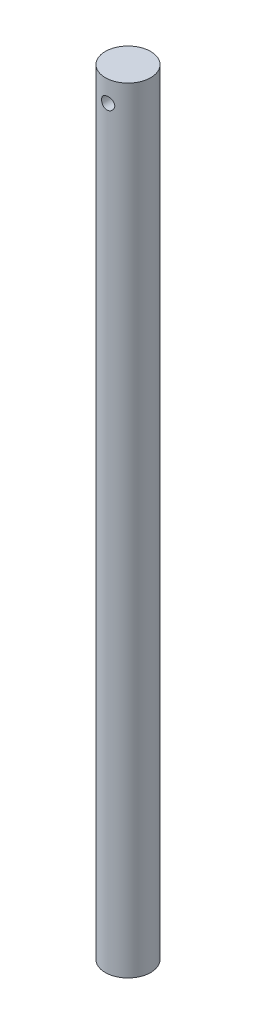
ISO-10303-21;
HEADER;
FILE_DESCRIPTION(('STEP AP214'),'2;1');
FILE_NAME('part.step','',(''),(''),'','','');
FILE_SCHEMA(('AUTOMOTIVE_DESIGN { 1 0 10303 214 1 1 1 1 }'));
ENDSEC;
DATA;
#1=APPLICATION_CONTEXT('core data for automotive mechanical design processes');
#2=APPLICATION_PROTOCOL_DEFINITION('international standard','automotive_design',2000,#1);
#3=PRODUCT_CONTEXT('',#1,'mechanical');
#4=PRODUCT('Part','Part','',(#3));
#5=PRODUCT_RELATED_PRODUCT_CATEGORY('part','',(#4));
#6=PRODUCT_DEFINITION_FORMATION('','',#4);
#7=PRODUCT_DEFINITION_CONTEXT('part definition',#1,'design');
#8=PRODUCT_DEFINITION('design','',#6,#7);
#9=PRODUCT_DEFINITION_SHAPE('','',#8);
#10=(LENGTH_UNIT() NAMED_UNIT(*) SI_UNIT(.MILLI.,.METRE.));
#11=(NAMED_UNIT(*) PLANE_ANGLE_UNIT() SI_UNIT($,.RADIAN.));
#12=(NAMED_UNIT(*) SI_UNIT($,.STERADIAN.) SOLID_ANGLE_UNIT());
#13=UNCERTAINTY_MEASURE_WITH_UNIT(LENGTH_MEASURE(1.E-05),#10,'distance_accuracy_value','');
#14=(GEOMETRIC_REPRESENTATION_CONTEXT(3) GLOBAL_UNCERTAINTY_ASSIGNED_CONTEXT((#13)) GLOBAL_UNIT_ASSIGNED_CONTEXT((#10,
#11,#12)) REPRESENTATION_CONTEXT('',''));
#15=CARTESIAN_POINT('',(0.,0.,0.));
#16=DIRECTION('',(0.,0.,1.));
#17=DIRECTION('',(1.,0.,0.));
#18=AXIS2_PLACEMENT_3D('',#15,#16,#17);
#19=CARTESIAN_POINT('',(0.,512.,0.));
#20=DIRECTION('',(0.,-1.,0.));
#21=DIRECTION('',(0.,0.,-1.));
#22=AXIS2_PLACEMENT_3D('',#19,#20,#21);
#23=CYLINDRICAL_SURFACE('',#22,15.);
#24=CARTESIAN_POINT('',(5.30770495649121,498.,14.0295498179677));
#25=CARTESIAN_POINT('',(5.30769959224886,497.783739327439,14.0295541757442));
#26=CARTESIAN_POINT('',(5.29009813870749,497.567424483658,14.0362493893093));
#27=CARTESIAN_POINT('',(5.22038978713614,497.141164185824,14.0623207434497));
#28=CARTESIAN_POINT('',(5.16826419925095,496.931222246198,14.0817037525759));
#29=CARTESIAN_POINT('',(5.0316298707426,496.524057681313,14.1310976182691));
#30=CARTESIAN_POINT('',(4.94719233779379,496.326808193703,14.1610850942173));
#31=CARTESIAN_POINT('',(4.74868054758793,495.949343782454,14.2288787835561));
#32=CARTESIAN_POINT('',(4.63460215544535,495.769131240248,14.2666860876588));
#33=CARTESIAN_POINT('',(4.37509789717877,495.423258307267,14.3484380110151));
#34=CARTESIAN_POINT('',(4.22864647086168,495.258409986383,14.392561122822));
#35=CARTESIAN_POINT('',(3.91091491172749,494.955075471113,14.4821257237557));
#36=CARTESIAN_POINT('',(3.73962886368514,494.81659557551,14.5275675249058));
#37=CARTESIAN_POINT('',(3.36857793527231,494.564124986432,14.6181603459711));
#38=CARTESIAN_POINT('',(3.16791631822234,494.451414252372,14.6632181812273));
#39=CARTESIAN_POINT('',(2.74920470735967,494.26170001138,14.7474546907574));
#40=CARTESIAN_POINT('',(2.53115620023421,494.184693455347,14.7866338668694));
#41=CARTESIAN_POINT('',(2.08710680913406,494.070076264587,14.8557624504811));
#42=CARTESIAN_POINT('',(1.86127634657731,494.031886721499,14.8858426389426));
#43=CARTESIAN_POINT('',(1.40530992000581,493.994659235417,14.9357839799075));
#44=CARTESIAN_POINT('',(1.17517517383315,493.99561038068,14.9556479789435));
#45=CARTESIAN_POINT('',(0.727043834646436,494.036237846807,14.9839853435056));
#46=CARTESIAN_POINT('',(0.508931507890129,494.074353973368,14.9928849922964));
#47=CARTESIAN_POINT('',(0.0818223563057033,494.186087390314,15.0012979417186));
#48=CARTESIAN_POINT('',(-0.127174978895807,494.259702690213,15.0008117685659));
#49=CARTESIAN_POINT('',(-0.527672012357053,494.439240814969,14.9920403710313));
#50=CARTESIAN_POINT('',(-0.719346286158504,494.544779704384,14.9838455117113));
#51=CARTESIAN_POINT('',(-1.08275279727886,494.78546660681,14.9619795548732));
#52=CARTESIAN_POINT('',(-1.2544827045583,494.920618074053,14.9483078183367));
#53=CARTESIAN_POINT('',(-1.57684141628954,495.219935848454,14.9177869469748));
#54=CARTESIAN_POINT('',(-1.72696364940269,495.38464168704,14.9008782510606));
#55=CARTESIAN_POINT('',(-1.99784008124165,495.736660643023,14.8669875978314));
#56=CARTESIAN_POINT('',(-2.11859153945209,495.923975867609,14.8500056338303));
#57=CARTESIAN_POINT('',(-2.32901936450524,496.319197302851,14.8184753074251));
#58=CARTESIAN_POINT('',(-2.41819907797438,496.527371679029,14.8039675548698));
#59=CARTESIAN_POINT('',(-2.56025415262669,496.956034877743,14.7800653602494));
#60=CARTESIAN_POINT('',(-2.61313290297579,497.176522548594,14.770670440852));
#61=CARTESIAN_POINT('',(-2.68059088422748,497.621142414171,14.7585775724258));
#62=CARTESIAN_POINT('',(-2.69555838305802,497.845213812294,14.7558117474356));
#63=CARTESIAN_POINT('',(-2.6878432649929,498.292676040669,14.7572190473804));
#64=CARTESIAN_POINT('',(-2.6651627334615,498.516066907929,14.7613917879808));
#65=CARTESIAN_POINT('',(-2.5833068844403,498.953424124662,14.775933201954));
#66=CARTESIAN_POINT('',(-2.5245126139958,499.167464203986,14.7862371480766));
#67=CARTESIAN_POINT('',(-2.37251625051476,499.582674631816,14.8113828298151));
#68=CARTESIAN_POINT('',(-2.27931110068596,499.783843835111,14.8262249685484));
#69=CARTESIAN_POINT('',(-2.05990307741392,500.170041554853,14.8583033372312));
#70=CARTESIAN_POINT('',(-1.9333486279022,500.354868262724,14.8755640981968));
#71=CARTESIAN_POINT('',(-1.65117773243151,500.700899750898,14.909518926402));
#72=CARTESIAN_POINT('',(-1.49555902256941,500.862102689328,14.9262129493769));
#73=CARTESIAN_POINT('',(-1.15774519799814,501.157918579498,14.9562230015559));
#74=CARTESIAN_POINT('',(-0.975302211555717,501.292252468668,14.9695039496758));
#75=CARTESIAN_POINT('',(-0.590115151947767,501.528354783517,14.9896260196463));
#76=CARTESIAN_POINT('',(-0.38737377203788,501.630127522014,14.996467994591));
#77=CARTESIAN_POINT('',(0.0291550204478174,501.796685081571,15.0013934542123));
#78=CARTESIAN_POINT('',(0.242716472039169,501.862030493368,14.999614016764));
#79=CARTESIAN_POINT('',(0.677421871919597,501.956284818207,14.9862717538481));
#80=CARTESIAN_POINT('',(0.89856471023111,501.98519904187,14.9747103547207));
#81=CARTESIAN_POINT('',(1.33742711561895,502.005799673538,14.9418462478288));
#82=CARTESIAN_POINT('',(1.55512817383262,501.998209093196,14.9207401694748));
#83=CARTESIAN_POINT('',(1.98538674370051,501.94812218187,14.86960649052));
#84=CARTESIAN_POINT('',(2.19794391621437,501.905623555792,14.8395783034013));
#85=CARTESIAN_POINT('',(2.61511547688794,501.786602729198,14.7718125415715));
#86=CARTESIAN_POINT('',(2.81958678642815,501.709635919024,14.7339778248538));
#87=CARTESIAN_POINT('',(3.21254926837984,501.524034137336,14.6533210412559));
#88=CARTESIAN_POINT('',(3.40103679225939,501.415391960442,14.6104978409487));
#89=CARTESIAN_POINT('',(3.76483650983301,501.164376901407,14.5211055433402));
#90=CARTESIAN_POINT('',(3.93931601946941,501.02082499898,14.4744550818831));
#91=CARTESIAN_POINT('',(4.26194788047246,500.706149354285,14.3827670728105));
#92=CARTESIAN_POINT('',(4.41009228144431,500.535017315384,14.3377300155364));
#93=CARTESIAN_POINT('',(4.67823099986392,500.166196032103,14.2525198428885));
#94=CARTESIAN_POINT('',(4.79770682627493,499.968106570418,14.2124418765124));
#95=CARTESIAN_POINT('',(5.00116523068192,499.552954605183,14.1421363470368));
#96=CARTESIAN_POINT('',(5.08518057741332,499.335909842957,14.1118996956004));
#97=CARTESIAN_POINT('',(5.20196041116087,498.932692310999,14.069209617126));
#98=CARTESIAN_POINT('',(5.24150699258224,498.748703161167,14.0544437675192));
#99=CARTESIAN_POINT('',(5.29437906081642,498.376489140449,14.0346129105767));
#100=CARTESIAN_POINT('',(5.30770962631672,498.188265097114,14.0295460243181));
#101=CARTESIAN_POINT('',(5.30770495649121,498.,14.0295498179677));
#102=B_SPLINE_CURVE_WITH_KNOTS('',3,(#24,#25,#26,#27,#28,#29,#30,#31,#32,#33,#34,#35,#36,#37,
#38,#39,#40,#41,#42,#43,#44,#45,#46,#47,#48,#49,#50,#51,#52,#53,#54,#55,#56,#57,#58,#59,#60,#61,
#62,#63,#64,#65,#66,#67,#68,#69,#70,#71,#72,#73,#74,#75,#76,#77,#78,#79,#80,#81,#82,#83,#84,#85,
#86,#87,#88,#89,#90,#91,#92,#93,#94,#95,#96,#97,#98,#99,#100,#101),.UNSPECIFIED.,.T.,.F.,(4,2,2,
2,2,2,2,2,2,2,2,2,2,2,2,2,2,2,2,2,2,2,2,2,2,2,2,2,2,2,2,2,2,2,2,2,2,2,4),(0.,0.648075438394487,
1.29650200353989,1.9435077476,2.59060379715184,3.26226340347681,3.93408325241219,
4.63425212637813,5.33436119561797,6.02386862027489,6.71318382354562,7.37475471038608,
8.03628850637373,8.69016285442014,9.34411351593036,10.0115126560698,10.6789740457267,
11.3565119292435,12.0339865472014,12.7044942317218,13.374964777351,14.0384796935879,
14.7020535654664,15.3729241540079,16.0438470204985,16.7214125235252,17.3988882438409,
18.0656279836412,18.7322705206601,19.3857645901423,20.0393016282552,20.7015230338806,
21.3638951965609,22.0528580550518,22.7420285549377,23.4428552455431,24.1430328825125,
24.7073223908542,25.2715025716578),.UNSPECIFIED.);
#103=CARTESIAN_POINT('',(5.30770495649121,498.,14.0295498179677));
#104=VERTEX_POINT('',#103);
#105=EDGE_CURVE('E35',#104,#104,#102,.T.);
#106=ORIENTED_EDGE('',*,*,#105,.T.);
#107=EDGE_LOOP('',(#106));
#108=FACE_BOUND('',#107,.T.);
#109=CARTESIAN_POINT('',(0.,501.780199432142,-15.));
#110=CARTESIAN_POINT('',(-0.210657005995095,501.707319793671,-14.9999978140507));
#111=CARTESIAN_POINT('',(-0.415266107079427,501.616763363284,-14.9955242293521));
#112=CARTESIAN_POINT('',(-0.806425187593904,501.40296985063,-14.9795899588291));
#113=CARTESIAN_POINT('',(-0.992963361834294,501.279711599183,-14.9681247407792));
#114=CARTESIAN_POINT('',(-1.34256255033369,501.004254865152,-14.9408257366469));
#115=CARTESIAN_POINT('',(-1.50564930058133,500.852088539248,-14.9249967959263));
#116=CARTESIAN_POINT('',(-1.80424627315007,500.522923543379,-14.8918539983366));
#117=CARTESIAN_POINT('',(-1.93975785808865,500.345926101165,-14.8745402149006));
#118=CARTESIAN_POINT('',(-2.18121988066898,499.969290005992,-14.8410709431909));
#119=CARTESIAN_POINT('',(-2.28674914493666,499.769379353533,-14.8249341202057));
#120=CARTESIAN_POINT('',(-2.46275450406126,499.354408127305,-14.7967170013757));
#121=CARTESIAN_POINT('',(-2.53323238706525,499.139348327009,-14.784636498608));
#122=CARTESIAN_POINT('',(-2.636731436917,498.701292087867,-14.7665305479346));
#123=CARTESIAN_POINT('',(-2.66994072503751,498.478341423399,-14.760474707013));
#124=CARTESIAN_POINT('',(-2.69848501951228,498.029957892816,-14.7552838809509));
#125=CARTESIAN_POINT('',(-2.69382325998151,497.8045252403,-14.7561483048329));
#126=CARTESIAN_POINT('',(-2.64710929074024,497.360834859223,-14.7645976255955));
#127=CARTESIAN_POINT('',(-2.60556896666587,497.142521178851,-14.772090512381));
#128=CARTESIAN_POINT('',(-2.48707221222545,496.715996071737,-14.7924998941798));
#129=CARTESIAN_POINT('',(-2.41011364918744,496.507785254164,-14.8054167157855));
#130=CARTESIAN_POINT('',(-2.22240773673886,496.10584590339,-14.8347544272848));
#131=CARTESIAN_POINT('',(-2.11144772628897,495.912218357796,-14.8511971698706));
#132=CARTESIAN_POINT('',(-1.85896766869609,495.546096380692,-14.8849054934407));
#133=CARTESIAN_POINT('',(-1.71744445759945,495.373604140043,-14.902171159471));
#134=CARTESIAN_POINT('',(-1.40549742332679,495.052229775569,-14.9348400337576));
#135=CARTESIAN_POINT('',(-1.23470824590262,494.903698939801,-14.9502148603283));
#136=CARTESIAN_POINT('',(-0.870293742150307,494.637376112,-14.9758434611643));
#137=CARTESIAN_POINT('',(-0.676670250944912,494.519581652221,-14.9860976466133));
#138=CARTESIAN_POINT('',(-0.274080058200368,494.319237841481,-14.9988332129721));
#139=CARTESIAN_POINT('',(-0.0652815377394956,494.236355741065,-15.0013894746105));
#140=CARTESIAN_POINT('',(0.363133364598192,494.106691567187,-14.9971318943314));
#141=CARTESIAN_POINT('',(0.582747819377821,494.059903087428,-14.9903197158263));
#142=CARTESIAN_POINT('',(1.02108860896477,494.004308079118,-14.9667785050186));
#143=CARTESIAN_POINT('',(1.23972125645555,493.994660780473,-14.9502788626479));
#144=CARTESIAN_POINT('',(1.67471296352668,494.01092964378,-14.9078200918702));
#145=CARTESIAN_POINT('',(1.89107198873201,494.036846342648,-14.8818608206537));
#146=CARTESIAN_POINT('',(2.31641397011699,494.123173133584,-14.821624879975));
#147=CARTESIAN_POINT('',(2.5253663378166,494.183711775523,-14.7873174885547));
#148=CARTESIAN_POINT('',(2.92979392501172,494.337263023183,-14.7125338082041));
#149=CARTESIAN_POINT('',(3.12526639128147,494.430282239569,-14.6720562644287));
#150=CARTESIAN_POINT('',(3.50510559503998,494.650169814452,-14.586074561409));
#151=CARTESIAN_POINT('',(3.68878784204631,494.77816953439,-14.5404393594224));
#152=CARTESIAN_POINT('',(4.03230437448006,495.062933792838,-14.4489506826874));
#153=CARTESIAN_POINT('',(4.19213249547612,495.219705743468,-14.4030971546668));
#154=CARTESIAN_POINT('',(4.48790236000469,495.562980635797,-14.3137448496051));
#155=CARTESIAN_POINT('',(4.62306337767167,495.750184544115,-14.2703459499335));
#156=CARTESIAN_POINT('',(4.85974830873439,496.146305629384,-14.1914931071017));
#157=CARTESIAN_POINT('',(4.96127929767753,496.355218226797,-14.1560374932324));
#158=CARTESIAN_POINT('',(5.12464351500086,496.782705170107,-14.0977085294781));
#159=CARTESIAN_POINT('',(5.18753693100366,497.000827268038,-14.0745018743201));
#160=CARTESIAN_POINT('',(5.27555950578557,497.445526609347,-14.0417498832585));
#161=CARTESIAN_POINT('',(5.30070623458133,497.672099868584,-14.0321981914538));
#162=CARTESIAN_POINT('',(5.31183041845535,498.113110609416,-14.0279883724517));
#163=CARTESIAN_POINT('',(5.2999995923713,498.327488016124,-14.032496841262));
#164=CARTESIAN_POINT('',(5.2423867699797,498.750957333104,-14.0541207868461));
#165=CARTESIAN_POINT('',(5.19660542759025,498.960049345097,-14.0712360208018));
#166=CARTESIAN_POINT('',(5.07339836809526,499.365288455715,-14.116119714976));
#167=CARTESIAN_POINT('',(4.99626837886082,499.561537152828,-14.143788472209));
#168=CARTESIAN_POINT('',(4.81288000696596,499.938480960929,-14.2072363408078));
#169=CARTESIAN_POINT('',(4.70661486334092,500.11917244898,-14.2430173343262));
#170=CARTESIAN_POINT('',(4.46177203079215,500.469793146098,-14.3216587193427));
#171=CARTESIAN_POINT('',(4.32182398649894,500.638705115532,-14.3647869038412));
#172=CARTESIAN_POINT('',(4.0165833303184,500.951223392933,-14.4531062080197));
#173=CARTESIAN_POINT('',(3.8512836220316,501.094822591121,-14.4982979028193));
#174=CARTESIAN_POINT('',(3.49106567558638,501.359334536971,-14.5893278483121));
#175=CARTESIAN_POINT('',(3.29513103168124,501.478890529317,-14.6350993010179));
#176=CARTESIAN_POINT('',(2.88476154850701,501.683124781659,-14.7214830561464));
#177=CARTESIAN_POINT('',(2.6703259116724,501.767801537125,-14.7620951359652));
#178=CARTESIAN_POINT('',(2.23081623549241,501.898712185323,-14.8348440677328));
#179=CARTESIAN_POINT('',(2.00585747533919,501.945290702192,-14.8670550597595));
#180=CARTESIAN_POINT('',(1.55019050266504,501.999216844666,-14.9214414276678));
#181=CARTESIAN_POINT('',(1.31948709353901,502.006596208681,-14.9436249092124));
#182=CARTESIAN_POINT('',(0.904472734620068,501.983945410924,-14.9738608732821));
#183=CARTESIAN_POINT('',(0.719886468450858,501.960928488884,-14.9838252122594));
#184=CARTESIAN_POINT('',(0.355465612857806,501.889435953328,-14.9968955579683));
#185=CARTESIAN_POINT('',(0.175630845080221,501.84096129683,-15.0000018224892));
#186=CARTESIAN_POINT('',(0.,501.780199432142,-15.));
#187=B_SPLINE_CURVE_WITH_KNOTS('',3,(#109,#110,#111,#112,#113,#114,#115,#116,#117,#118,#119,
#120,#121,#122,#123,#124,#125,#126,#127,#128,#129,#130,#131,#132,#133,#134,#135,#136,#137,#138,
#139,#140,#141,#142,#143,#144,#145,#146,#147,#148,#149,#150,#151,#152,#153,#154,#155,#156,#157,
#158,#159,#160,#161,#162,#163,#164,#165,#166,#167,#168,#169,#170,#171,#172,#173,#174,#175,#176,
#177,#178,#179,#180,#181,#182,#183,#184,#185,#186),.UNSPECIFIED.,.T.,.F.,(4,2,2,2,2,2,2,2,2,2,2,
2,2,2,2,2,2,2,2,2,2,2,2,2,2,2,2,2,2,2,2,2,2,2,2,2,2,2,4),(0.,0.668034999379453,1.33650350383001,
2.00423272761989,2.67192894777912,3.34858681025555,4.02521014947287,4.69840250471876,
5.37153737123045,6.03547251073445,6.69944763362523,7.36766339339902,8.03594836117362,
8.71328152452237,9.3905602897605,10.0612292663091,10.7317791776664,11.3870573078816,
12.0423453310655,12.7000823564786,13.3579533270589,14.0403190158612,14.7228607387849,
15.4242345861078,16.1254607748957,16.806468735733,17.4871596081969,18.1282860106809,
18.7694000648027,19.4046015685691,20.0399505990999,20.7076672660328,21.3755711814912,
22.0743719535263,22.7732028654652,23.4656402077539,24.1575168181552,24.7144978756541,
25.2714579963486),.UNSPECIFIED.);
#188=CARTESIAN_POINT('',(0.,501.780199432142,-15.));
#189=VERTEX_POINT('',#188);
#190=EDGE_CURVE('E10',#189,#189,#187,.T.);
#191=ORIENTED_EDGE('',*,*,#190,.T.);
#192=EDGE_LOOP('',(#191));
#193=FACE_BOUND('',#192,.T.);
#194=CARTESIAN_POINT('',(0.,512.,0.));
#195=DIRECTION('',(0.,1.,0.));
#196=DIRECTION('',(0.,0.,1.));
#197=AXIS2_PLACEMENT_3D('',#194,#195,#196);
#198=CIRCLE('',#197,15.);
#199=CARTESIAN_POINT('',(0.,512.,15.));
#200=VERTEX_POINT('',#199);
#201=EDGE_CURVE('E42',#200,#200,#198,.T.);
#202=ORIENTED_EDGE('',*,*,#201,.F.);
#203=EDGE_LOOP('',(#202));
#204=FACE_BOUND('',#203,.T.);
#205=CARTESIAN_POINT('',(0.,0.,0.));
#206=DIRECTION('',(0.,1.,0.));
#207=DIRECTION('',(0.,0.,1.));
#208=AXIS2_PLACEMENT_3D('',#205,#206,#207);
#209=CIRCLE('',#208,15.);
#210=CARTESIAN_POINT('',(0.,0.,15.));
#211=VERTEX_POINT('',#210);
#212=EDGE_CURVE('E46',#211,#211,#209,.T.);
#213=ORIENTED_EDGE('',*,*,#212,.T.);
#214=EDGE_LOOP('',(#213));
#215=FACE_BOUND('',#214,.T.);
#216=ADVANCED_FACE('F31',(#108,#193,#204,#215),#23,.T.);
#217=CARTESIAN_POINT('',(0.,512.,0.));
#218=DIRECTION('',(0.,1.,0.));
#219=DIRECTION('',(0.,0.,1.));
#220=AXIS2_PLACEMENT_3D('',#217,#218,#219);
#221=PLANE('',#220);
#222=ORIENTED_EDGE('',*,*,#201,.T.);
#223=EDGE_LOOP('',(#222));
#224=FACE_BOUND('',#223,.T.);
#225=ADVANCED_FACE('F57',(#224),#221,.T.);
#226=CARTESIAN_POINT('',(0.,0.,0.));
#227=DIRECTION('',(0.,1.,0.));
#228=DIRECTION('',(0.,0.,1.));
#229=AXIS2_PLACEMENT_3D('',#226,#227,#228);
#230=PLANE('',#229);
#231=ORIENTED_EDGE('',*,*,#212,.F.);
#232=EDGE_LOOP('',(#231));
#233=FACE_BOUND('',#232,.T.);
#234=ADVANCED_FACE('F55',(#233),#230,.F.);
#235=CARTESIAN_POINT('',(1.30770495649121,498.,-15.));
#236=DIRECTION('',(0.,0.,1.));
#237=DIRECTION('',(1.,0.,0.));
#238=AXIS2_PLACEMENT_3D('',#235,#236,#237);
#239=CYLINDRICAL_SURFACE('',#238,3.99999999999999);
#240=ORIENTED_EDGE('',*,*,#105,.F.);
#241=EDGE_LOOP('',(#240));
#242=FACE_BOUND('',#241,.T.);
#243=ORIENTED_EDGE('',*,*,#190,.F.);
#244=EDGE_LOOP('',(#243));
#245=FACE_BOUND('',#244,.T.);
#246=ADVANCED_FACE('F51',(#242,#245),#239,.F.);
#247=CLOSED_SHELL('',(#216,#225,#234,#246));
#248=MANIFOLD_SOLID_BREP('B2',#247);
#249=ADVANCED_BREP_SHAPE_REPRESENTATION('',(#18,#248),#14);
#250=SHAPE_DEFINITION_REPRESENTATION(#9,#249);
ENDSEC;
END-ISO-10303-21;
